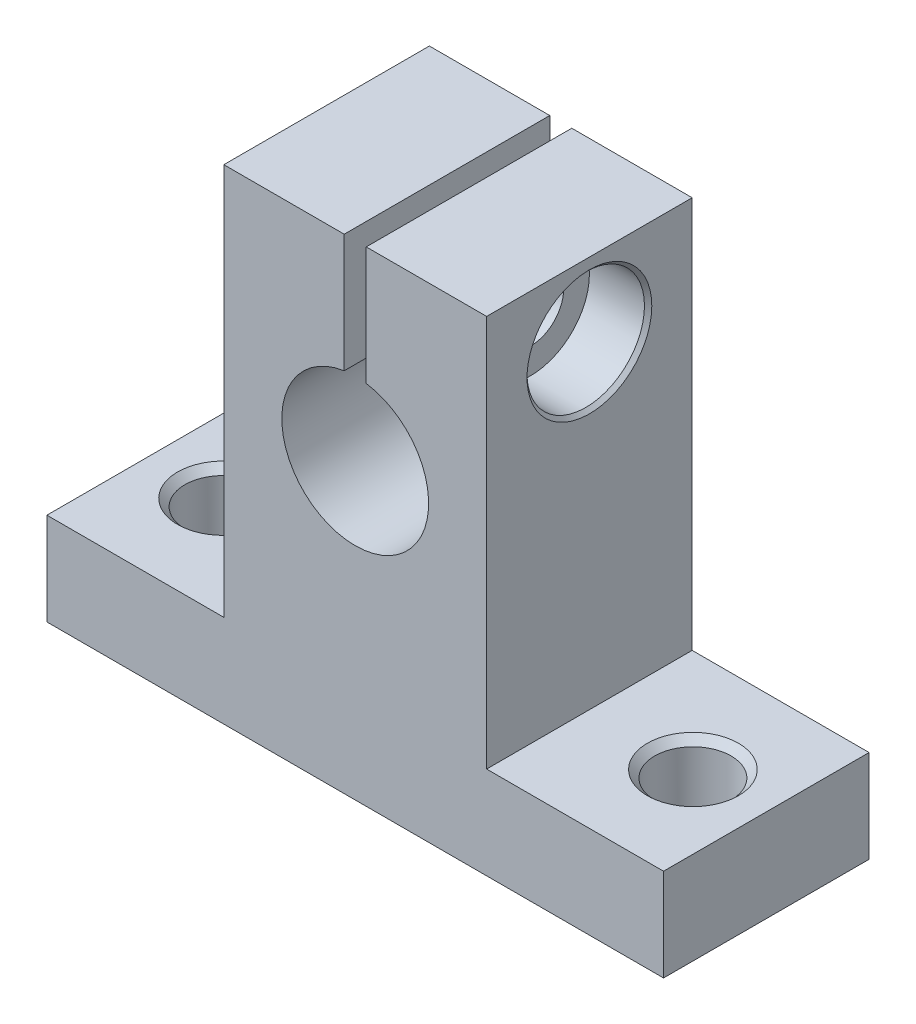
ISO-10303-21;
HEADER;
FILE_DESCRIPTION(('STEP AP214'),'2;1');
FILE_NAME('part.step','',(''),(''),'','','');
FILE_SCHEMA(('AUTOMOTIVE_DESIGN { 1 0 10303 214 1 1 1 1 }'));
ENDSEC;
DATA;
#1=APPLICATION_CONTEXT('core data for automotive mechanical design processes');
#2=APPLICATION_PROTOCOL_DEFINITION('international standard','automotive_design',2000,#1);
#3=PRODUCT_CONTEXT('',#1,'mechanical');
#4=PRODUCT('Part','Part','',(#3));
#5=PRODUCT_RELATED_PRODUCT_CATEGORY('part','',(#4));
#6=PRODUCT_DEFINITION_FORMATION('','',#4);
#7=PRODUCT_DEFINITION_CONTEXT('part definition',#1,'design');
#8=PRODUCT_DEFINITION('design','',#6,#7);
#9=PRODUCT_DEFINITION_SHAPE('','',#8);
#10=(LENGTH_UNIT() NAMED_UNIT(*) SI_UNIT(.MILLI.,.METRE.));
#11=(NAMED_UNIT(*) PLANE_ANGLE_UNIT() SI_UNIT($,.RADIAN.));
#12=(NAMED_UNIT(*) SI_UNIT($,.STERADIAN.) SOLID_ANGLE_UNIT());
#13=UNCERTAINTY_MEASURE_WITH_UNIT(LENGTH_MEASURE(1.E-05),#10,'distance_accuracy_value','');
#14=(GEOMETRIC_REPRESENTATION_CONTEXT(3) GLOBAL_UNCERTAINTY_ASSIGNED_CONTEXT((#13)) GLOBAL_UNIT_ASSIGNED_CONTEXT((#10,
#11,#12)) REPRESENTATION_CONTEXT('',''));
#15=CARTESIAN_POINT('',(0.,0.,0.));
#16=DIRECTION('',(0.,0.,1.));
#17=DIRECTION('',(1.,0.,0.));
#18=AXIS2_PLACEMENT_3D('',#15,#16,#17);
#19=CARTESIAN_POINT('',(-0.75,33.,7.));
#20=DIRECTION('',(-1.,0.,0.));
#21=DIRECTION('',(0.,-1.,0.));
#22=AXIS2_PLACEMENT_3D('',#19,#20,#21);
#23=PLANE('',#22);
#24=DIRECTION('',(0.,1.,0.));
#25=VECTOR('',#24,1.);
#26=CARTESIAN_POINT('',(-0.75,33.,-7.));
#27=LINE('',#26,#25);
#28=CARTESIAN_POINT('',(-0.750000000000001,24.9434299833213,-7.));
#29=VERTEX_POINT('',#28);
#30=CARTESIAN_POINT('',(-0.75,33.,-7.));
#31=VERTEX_POINT('',#30);
#32=EDGE_CURVE('E176',#29,#31,#27,.T.);
#33=ORIENTED_EDGE('',*,*,#32,.T.);
#34=DIRECTION('',(0.,0.,-1.));
#35=VECTOR('',#34,1.);
#36=CARTESIAN_POINT('',(-0.75,33.,7.));
#37=LINE('',#36,#35);
#38=CARTESIAN_POINT('',(-0.75,33.,7.));
#39=VERTEX_POINT('',#38);
#40=EDGE_CURVE('E149',#39,#31,#37,.T.);
#41=ORIENTED_EDGE('',*,*,#40,.F.);
#42=DIRECTION('',(0.,1.,0.));
#43=VECTOR('',#42,1.);
#44=CARTESIAN_POINT('',(-0.75,33.,7.));
#45=LINE('',#44,#43);
#46=CARTESIAN_POINT('',(-0.750000000000001,24.9434299833213,7.));
#47=VERTEX_POINT('',#46);
#48=EDGE_CURVE('E140',#47,#39,#45,.T.);
#49=ORIENTED_EDGE('',*,*,#48,.F.);
#50=DIRECTION('',(0.,0.,-1.));
#51=VECTOR('',#50,1.);
#52=CARTESIAN_POINT('',(-0.750000000000001,24.9434299833213,7.));
#53=LINE('',#52,#51);
#54=EDGE_CURVE('E185',#47,#29,#53,.T.);
#55=ORIENTED_EDGE('',*,*,#54,.T.);
#56=EDGE_LOOP('',(#33,#41,#49,#55));
#57=FACE_BOUND('',#56,.T.);
#58=CARTESIAN_POINT('',(-0.75,28.,0.));
#59=DIRECTION('',(1.,0.,0.));
#60=DIRECTION('',(0.,0.,-1.));
#61=AXIS2_PLACEMENT_3D('',#58,#59,#60);
#62=CIRCLE('',#61,1.65);
#63=CARTESIAN_POINT('',(-0.75,28.,-1.65));
#64=VERTEX_POINT('',#63);
#65=EDGE_CURVE('E357',#64,#64,#62,.T.);
#66=ORIENTED_EDGE('',*,*,#65,.F.);
#67=EDGE_LOOP('',(#66));
#68=FACE_BOUND('',#67,.T.);
#69=ADVANCED_FACE('F36',(#57,#68),#23,.F.);
#70=CARTESIAN_POINT('',(-21.,6.3,7.));
#71=DIRECTION('',(1.,0.,0.));
#72=DIRECTION('',(0.,0.,-1.));
#73=AXIS2_PLACEMENT_3D('',#70,#71,#72);
#74=PLANE('',#73);
#75=DIRECTION('',(0.,-1.,0.));
#76=VECTOR('',#75,1.);
#77=CARTESIAN_POINT('',(-21.,6.3,-7.));
#78=LINE('',#77,#76);
#79=CARTESIAN_POINT('',(-21.,6.3,-7.));
#80=VERTEX_POINT('',#79);
#81=CARTESIAN_POINT('',(-21.,0.,-7.));
#82=VERTEX_POINT('',#81);
#83=EDGE_CURVE('E158',#80,#82,#78,.T.);
#84=ORIENTED_EDGE('',*,*,#83,.T.);
#85=DIRECTION('',(0.,0.,-1.));
#86=VECTOR('',#85,1.);
#87=CARTESIAN_POINT('',(-21.,0.,7.));
#88=LINE('',#87,#86);
#89=CARTESIAN_POINT('',(-21.,0.,7.));
#90=VERTEX_POINT('',#89);
#91=EDGE_CURVE('E206',#90,#82,#88,.T.);
#92=ORIENTED_EDGE('',*,*,#91,.F.);
#93=DIRECTION('',(0.,-1.,0.));
#94=VECTOR('',#93,1.);
#95=CARTESIAN_POINT('',(-21.,6.3,7.));
#96=LINE('',#95,#94);
#97=CARTESIAN_POINT('',(-21.,6.3,7.));
#98=VERTEX_POINT('',#97);
#99=EDGE_CURVE('E181',#98,#90,#96,.T.);
#100=ORIENTED_EDGE('',*,*,#99,.F.);
#101=DIRECTION('',(0.,0.,-1.));
#102=VECTOR('',#101,1.);
#103=CARTESIAN_POINT('',(-21.,6.3,7.));
#104=LINE('',#103,#102);
#105=EDGE_CURVE('E154',#98,#80,#104,.T.);
#106=ORIENTED_EDGE('',*,*,#105,.T.);
#107=EDGE_LOOP('',(#84,#92,#100,#106));
#108=FACE_BOUND('',#107,.T.);
#109=ADVANCED_FACE('F233',(#108),#74,.F.);
#110=CARTESIAN_POINT('',(-21.,0.,7.));
#111=DIRECTION('',(0.,1.,0.));
#112=DIRECTION('',(0.,0.,1.));
#113=AXIS2_PLACEMENT_3D('',#110,#111,#112);
#114=PLANE('',#113);
#115=CARTESIAN_POINT('',(16.,0.,0.));
#116=DIRECTION('',(0.,1.,0.));
#117=DIRECTION('',(0.,0.,1.));
#118=AXIS2_PLACEMENT_3D('',#115,#116,#117);
#119=CIRCLE('',#118,2.6);
#120=CARTESIAN_POINT('',(16.,0.,2.6));
#121=VERTEX_POINT('',#120);
#122=EDGE_CURVE('E162',#121,#121,#119,.F.);
#123=ORIENTED_EDGE('',*,*,#122,.F.);
#124=EDGE_LOOP('',(#123));
#125=FACE_BOUND('',#124,.T.);
#126=CARTESIAN_POINT('',(-16.,0.,0.));
#127=DIRECTION('',(0.,1.,0.));
#128=DIRECTION('',(0.,0.,1.));
#129=AXIS2_PLACEMENT_3D('',#126,#127,#128);
#130=CIRCLE('',#129,2.6);
#131=CARTESIAN_POINT('',(-16.,0.,2.6));
#132=VERTEX_POINT('',#131);
#133=EDGE_CURVE('E279',#132,#132,#130,.F.);
#134=ORIENTED_EDGE('',*,*,#133,.F.);
#135=EDGE_LOOP('',(#134));
#136=FACE_BOUND('',#135,.T.);
#137=DIRECTION('',(1.,0.,0.));
#138=VECTOR('',#137,1.);
#139=CARTESIAN_POINT('',(-21.,0.,-7.));
#140=LINE('',#139,#138);
#141=CARTESIAN_POINT('',(21.,0.,-7.));
#142=VERTEX_POINT('',#141);
#143=EDGE_CURVE('E161',#82,#142,#140,.T.);
#144=ORIENTED_EDGE('',*,*,#143,.T.);
#145=DIRECTION('',(0.,0.,-1.));
#146=VECTOR('',#145,1.);
#147=CARTESIAN_POINT('',(21.,0.,7.));
#148=LINE('',#147,#146);
#149=CARTESIAN_POINT('',(21.,0.,7.));
#150=VERTEX_POINT('',#149);
#151=EDGE_CURVE('E203',#150,#142,#148,.T.);
#152=ORIENTED_EDGE('',*,*,#151,.F.);
#153=DIRECTION('',(1.,0.,0.));
#154=VECTOR('',#153,1.);
#155=CARTESIAN_POINT('',(-21.,0.,7.));
#156=LINE('',#155,#154);
#157=EDGE_CURVE('E109',#90,#150,#156,.T.);
#158=ORIENTED_EDGE('',*,*,#157,.F.);
#159=ORIENTED_EDGE('',*,*,#91,.T.);
#160=EDGE_LOOP('',(#144,#152,#158,#159));
#161=FACE_BOUND('',#160,.T.);
#162=ADVANCED_FACE('F239',(#125,#136,#161),#114,.F.);
#163=CARTESIAN_POINT('',(21.,6.3,7.));
#164=DIRECTION('',(-1.,0.,0.));
#165=DIRECTION('',(0.,0.,1.));
#166=AXIS2_PLACEMENT_3D('',#163,#164,#165);
#167=PLANE('',#166);
#168=DIRECTION('',(0.,1.,0.));
#169=VECTOR('',#168,1.);
#170=CARTESIAN_POINT('',(21.,6.3,-7.));
#171=LINE('',#170,#169);
#172=CARTESIAN_POINT('',(21.,6.3,-7.));
#173=VERTEX_POINT('',#172);
#174=EDGE_CURVE('E164',#142,#173,#171,.T.);
#175=ORIENTED_EDGE('',*,*,#174,.T.);
#176=DIRECTION('',(0.,0.,-1.));
#177=VECTOR('',#176,1.);
#178=CARTESIAN_POINT('',(21.,6.3,7.));
#179=LINE('',#178,#177);
#180=CARTESIAN_POINT('',(21.,6.3,7.));
#181=VERTEX_POINT('',#180);
#182=EDGE_CURVE('E200',#181,#173,#179,.T.);
#183=ORIENTED_EDGE('',*,*,#182,.F.);
#184=DIRECTION('',(0.,1.,0.));
#185=VECTOR('',#184,1.);
#186=CARTESIAN_POINT('',(21.,6.3,7.));
#187=LINE('',#186,#185);
#188=EDGE_CURVE('E286',#150,#181,#187,.T.);
#189=ORIENTED_EDGE('',*,*,#188,.F.);
#190=ORIENTED_EDGE('',*,*,#151,.T.);
#191=EDGE_LOOP('',(#175,#183,#189,#190));
#192=FACE_BOUND('',#191,.T.);
#193=ADVANCED_FACE('F265',(#192),#167,.F.);
#194=CARTESIAN_POINT('',(8.95,6.3,7.));
#195=DIRECTION('',(0.,-1.,0.));
#196=DIRECTION('',(0.,0.,-1.));
#197=AXIS2_PLACEMENT_3D('',#194,#195,#196);
#198=PLANE('',#197);
#199=CARTESIAN_POINT('',(16.,6.3,0.));
#200=DIRECTION('',(0.,-1.,0.));
#201=DIRECTION('',(0.,0.,-1.));
#202=AXIS2_PLACEMENT_3D('',#199,#200,#201);
#203=CIRCLE('',#202,3.09999999999999);
#204=CARTESIAN_POINT('',(16.,6.3,-3.09999999999999));
#205=VERTEX_POINT('',#204);
#206=EDGE_CURVE('E11',#205,#205,#203,.T.);
#207=ORIENTED_EDGE('',*,*,#206,.T.);
#208=EDGE_LOOP('',(#207));
#209=FACE_BOUND('',#208,.T.);
#210=DIRECTION('',(-1.,0.,0.));
#211=VECTOR('',#210,1.);
#212=CARTESIAN_POINT('',(8.95,6.3,-7.));
#213=LINE('',#212,#211);
#214=CARTESIAN_POINT('',(8.95,6.3,-7.));
#215=VERTEX_POINT('',#214);
#216=EDGE_CURVE('E166',#173,#215,#213,.T.);
#217=ORIENTED_EDGE('',*,*,#216,.T.);
#218=DIRECTION('',(0.,0.,-1.));
#219=VECTOR('',#218,1.);
#220=CARTESIAN_POINT('',(8.95,6.3,7.));
#221=LINE('',#220,#219);
#222=CARTESIAN_POINT('',(8.95,6.3,7.));
#223=VERTEX_POINT('',#222);
#224=EDGE_CURVE('E197',#223,#215,#221,.T.);
#225=ORIENTED_EDGE('',*,*,#224,.F.);
#226=DIRECTION('',(-1.,0.,0.));
#227=VECTOR('',#226,1.);
#228=CARTESIAN_POINT('',(8.95,6.3,7.));
#229=LINE('',#228,#227);
#230=EDGE_CURVE('E300',#181,#223,#229,.T.);
#231=ORIENTED_EDGE('',*,*,#230,.F.);
#232=ORIENTED_EDGE('',*,*,#182,.T.);
#233=EDGE_LOOP('',(#217,#225,#231,#232));
#234=FACE_BOUND('',#233,.T.);
#235=ADVANCED_FACE('F261',(#209,#234),#198,.F.);
#236=CARTESIAN_POINT('',(8.95,33.,7.));
#237=DIRECTION('',(-1.,0.,0.));
#238=DIRECTION('',(0.,-1.,0.));
#239=AXIS2_PLACEMENT_3D('',#236,#237,#238);
#240=PLANE('',#239);
#241=CARTESIAN_POINT('',(8.95,28.,0.));
#242=DIRECTION('',(1.,0.,0.));
#243=DIRECTION('',(0.,0.,-1.));
#244=AXIS2_PLACEMENT_3D('',#241,#242,#243);
#245=CIRCLE('',#244,4.25);
#246=CARTESIAN_POINT('',(8.95,28.,-4.25));
#247=VERTEX_POINT('',#246);
#248=EDGE_CURVE('E359',#247,#247,#245,.T.);
#249=ORIENTED_EDGE('',*,*,#248,.F.);
#250=EDGE_LOOP('',(#249));
#251=FACE_BOUND('',#250,.T.);
#252=DIRECTION('',(0.,1.,0.));
#253=VECTOR('',#252,1.);
#254=CARTESIAN_POINT('',(8.95,33.,-7.));
#255=LINE('',#254,#253);
#256=CARTESIAN_POINT('',(8.95,33.,-7.));
#257=VERTEX_POINT('',#256);
#258=EDGE_CURVE('E168',#215,#257,#255,.T.);
#259=ORIENTED_EDGE('',*,*,#258,.T.);
#260=DIRECTION('',(0.,0.,-1.));
#261=VECTOR('',#260,1.);
#262=CARTESIAN_POINT('',(8.95,33.,7.));
#263=LINE('',#262,#261);
#264=CARTESIAN_POINT('',(8.95,33.,7.));
#265=VERTEX_POINT('',#264);
#266=EDGE_CURVE('E194',#265,#257,#263,.T.);
#267=ORIENTED_EDGE('',*,*,#266,.F.);
#268=DIRECTION('',(0.,1.,0.));
#269=VECTOR('',#268,1.);
#270=CARTESIAN_POINT('',(8.95,33.,7.));
#271=LINE('',#270,#269);
#272=EDGE_CURVE('E297',#223,#265,#271,.T.);
#273=ORIENTED_EDGE('',*,*,#272,.F.);
#274=ORIENTED_EDGE('',*,*,#224,.T.);
#275=EDGE_LOOP('',(#259,#267,#273,#274));
#276=FACE_BOUND('',#275,.T.);
#277=ADVANCED_FACE('F257',(#251,#276),#240,.F.);
#278=CARTESIAN_POINT('',(0.75,33.,7.));
#279=DIRECTION('',(0.,-1.,0.));
#280=DIRECTION('',(0.,0.,-1.));
#281=AXIS2_PLACEMENT_3D('',#278,#279,#280);
#282=PLANE('',#281);
#283=DIRECTION('',(-1.,0.,0.));
#284=VECTOR('',#283,1.);
#285=CARTESIAN_POINT('',(0.75,33.,-7.));
#286=LINE('',#285,#284);
#287=CARTESIAN_POINT('',(0.75,33.,-7.));
#288=VERTEX_POINT('',#287);
#289=EDGE_CURVE('E170',#257,#288,#286,.T.);
#290=ORIENTED_EDGE('',*,*,#289,.T.);
#291=DIRECTION('',(0.,0.,-1.));
#292=VECTOR('',#291,1.);
#293=CARTESIAN_POINT('',(0.75,33.,7.));
#294=LINE('',#293,#292);
#295=CARTESIAN_POINT('',(0.75,33.,7.));
#296=VERTEX_POINT('',#295);
#297=EDGE_CURVE('E191',#296,#288,#294,.T.);
#298=ORIENTED_EDGE('',*,*,#297,.F.);
#299=DIRECTION('',(-1.,0.,0.));
#300=VECTOR('',#299,1.);
#301=CARTESIAN_POINT('',(0.75,33.,7.));
#302=LINE('',#301,#300);
#303=EDGE_CURVE('E299',#265,#296,#302,.T.);
#304=ORIENTED_EDGE('',*,*,#303,.F.);
#305=ORIENTED_EDGE('',*,*,#266,.T.);
#306=EDGE_LOOP('',(#290,#298,#304,#305));
#307=FACE_BOUND('',#306,.T.);
#308=ADVANCED_FACE('F253',(#307),#282,.F.);
#309=CARTESIAN_POINT('',(0.75,33.,7.));
#310=DIRECTION('',(1.,0.,0.));
#311=DIRECTION('',(0.,1.,0.));
#312=AXIS2_PLACEMENT_3D('',#309,#310,#311);
#313=PLANE('',#312);
#314=CARTESIAN_POINT('',(0.750000000000001,28.,0.));
#315=DIRECTION('',(1.,0.,0.));
#316=DIRECTION('',(0.,1.,0.));
#317=AXIS2_PLACEMENT_3D('',#314,#315,#316);
#318=CIRCLE('',#317,2.25);
#319=CARTESIAN_POINT('',(0.75,30.25,0.));
#320=VERTEX_POINT('',#319);
#321=EDGE_CURVE('E373',#320,#320,#318,.T.);
#322=ORIENTED_EDGE('',*,*,#321,.T.);
#323=EDGE_LOOP('',(#322));
#324=FACE_BOUND('',#323,.T.);
#325=DIRECTION('',(0.,-1.,0.));
#326=VECTOR('',#325,1.);
#327=CARTESIAN_POINT('',(0.75,33.,-7.));
#328=LINE('',#327,#326);
#329=CARTESIAN_POINT('',(0.750000000000002,24.9434299833213,-7.));
#330=VERTEX_POINT('',#329);
#331=EDGE_CURVE('E172',#288,#330,#328,.T.);
#332=ORIENTED_EDGE('',*,*,#331,.T.);
#333=DIRECTION('',(0.,0.,-1.));
#334=VECTOR('',#333,1.);
#335=CARTESIAN_POINT('',(0.750000000000002,24.9434299833213,7.));
#336=LINE('',#335,#334);
#337=CARTESIAN_POINT('',(0.750000000000002,24.9434299833213,7.));
#338=VERTEX_POINT('',#337);
#339=EDGE_CURVE('E188',#338,#330,#336,.T.);
#340=ORIENTED_EDGE('',*,*,#339,.F.);
#341=DIRECTION('',(0.,-1.,0.));
#342=VECTOR('',#341,1.);
#343=CARTESIAN_POINT('',(0.75,33.,7.));
#344=LINE('',#343,#342);
#345=EDGE_CURVE('E302',#296,#338,#344,.T.);
#346=ORIENTED_EDGE('',*,*,#345,.F.);
#347=ORIENTED_EDGE('',*,*,#297,.T.);
#348=EDGE_LOOP('',(#332,#340,#346,#347));
#349=FACE_BOUND('',#348,.T.);
#350=ADVANCED_FACE('F249',(#324,#349),#313,.F.);
#351=CARTESIAN_POINT('',(0.,20.,7.));
#352=DIRECTION('',(0.,0.,-1.));
#353=DIRECTION('',(-1.,0.,0.));
#354=AXIS2_PLACEMENT_3D('',#351,#352,#353);
#355=CYLINDRICAL_SURFACE('',#354,5.);
#356=CARTESIAN_POINT('',(0.,20.,-7.));
#357=DIRECTION('',(0.,0.,-1.));
#358=DIRECTION('',(1.,0.,0.));
#359=AXIS2_PLACEMENT_3D('',#356,#357,#358);
#360=CIRCLE('',#359,5.);
#361=EDGE_CURVE('E174',#330,#29,#360,.T.);
#362=ORIENTED_EDGE('',*,*,#361,.T.);
#363=ORIENTED_EDGE('',*,*,#54,.F.);
#364=CARTESIAN_POINT('',(0.,20.,7.));
#365=DIRECTION('',(0.,0.,-1.));
#366=DIRECTION('',(1.,0.,0.));
#367=AXIS2_PLACEMENT_3D('',#364,#365,#366);
#368=CIRCLE('',#367,5.);
#369=EDGE_CURVE('E308',#338,#47,#368,.T.);
#370=ORIENTED_EDGE('',*,*,#369,.F.);
#371=ORIENTED_EDGE('',*,*,#339,.T.);
#372=EDGE_LOOP('',(#362,#363,#370,#371));
#373=FACE_BOUND('',#372,.T.);
#374=ADVANCED_FACE('F246',(#373),#355,.F.);
#375=CARTESIAN_POINT('',(-8.95,33.,7.));
#376=DIRECTION('',(0.,-1.,0.));
#377=DIRECTION('',(0.,0.,-1.));
#378=AXIS2_PLACEMENT_3D('',#375,#376,#377);
#379=PLANE('',#378);
#380=DIRECTION('',(-1.,0.,0.));
#381=VECTOR('',#380,1.);
#382=CARTESIAN_POINT('',(-8.95,33.,-7.));
#383=LINE('',#382,#381);
#384=CARTESIAN_POINT('',(-8.95,33.,-7.));
#385=VERTEX_POINT('',#384);
#386=EDGE_CURVE('E148',#31,#385,#383,.T.);
#387=ORIENTED_EDGE('',*,*,#386,.T.);
#388=DIRECTION('',(0.,0.,-1.));
#389=VECTOR('',#388,1.);
#390=CARTESIAN_POINT('',(-8.95,33.,7.));
#391=LINE('',#390,#389);
#392=CARTESIAN_POINT('',(-8.95,33.,7.));
#393=VERTEX_POINT('',#392);
#394=EDGE_CURVE('E145',#393,#385,#391,.T.);
#395=ORIENTED_EDGE('',*,*,#394,.F.);
#396=DIRECTION('',(-1.,0.,0.));
#397=VECTOR('',#396,1.);
#398=CARTESIAN_POINT('',(-8.95,33.,7.));
#399=LINE('',#398,#397);
#400=EDGE_CURVE('E134',#39,#393,#399,.T.);
#401=ORIENTED_EDGE('',*,*,#400,.F.);
#402=ORIENTED_EDGE('',*,*,#40,.T.);
#403=EDGE_LOOP('',(#387,#395,#401,#402));
#404=FACE_BOUND('',#403,.T.);
#405=ADVANCED_FACE('F146',(#404),#379,.F.);
#406=CARTESIAN_POINT('',(-8.95,33.,7.));
#407=DIRECTION('',(1.,0.,0.));
#408=DIRECTION('',(0.,1.,0.));
#409=AXIS2_PLACEMENT_3D('',#406,#407,#408);
#410=PLANE('',#409);
#411=CARTESIAN_POINT('',(-8.95,28.,0.));
#412=DIRECTION('',(1.,0.,0.));
#413=DIRECTION('',(0.,1.,0.));
#414=AXIS2_PLACEMENT_3D('',#411,#412,#413);
#415=CIRCLE('',#414,1.65);
#416=CARTESIAN_POINT('',(-8.95,29.65,0.));
#417=VERTEX_POINT('',#416);
#418=EDGE_CURVE('E354',#417,#417,#415,.T.);
#419=ORIENTED_EDGE('',*,*,#418,.T.);
#420=EDGE_LOOP('',(#419));
#421=FACE_BOUND('',#420,.T.);
#422=DIRECTION('',(0.,-1.,0.));
#423=VECTOR('',#422,1.);
#424=CARTESIAN_POINT('',(-8.95,33.,-7.));
#425=LINE('',#424,#423);
#426=CARTESIAN_POINT('',(-8.95,6.3,-7.));
#427=VERTEX_POINT('',#426);
#428=EDGE_CURVE('E94',#385,#427,#425,.T.);
#429=ORIENTED_EDGE('',*,*,#428,.T.);
#430=DIRECTION('',(0.,0.,-1.));
#431=VECTOR('',#430,1.);
#432=CARTESIAN_POINT('',(-8.95,6.3,7.));
#433=LINE('',#432,#431);
#434=CARTESIAN_POINT('',(-8.95,6.3,7.));
#435=VERTEX_POINT('',#434);
#436=EDGE_CURVE('E150',#435,#427,#433,.T.);
#437=ORIENTED_EDGE('',*,*,#436,.F.);
#438=DIRECTION('',(0.,-1.,0.));
#439=VECTOR('',#438,1.);
#440=CARTESIAN_POINT('',(-8.95,33.,7.));
#441=LINE('',#440,#439);
#442=EDGE_CURVE('E138',#393,#435,#441,.T.);
#443=ORIENTED_EDGE('',*,*,#442,.F.);
#444=ORIENTED_EDGE('',*,*,#394,.T.);
#445=EDGE_LOOP('',(#429,#437,#443,#444));
#446=FACE_BOUND('',#445,.T.);
#447=ADVANCED_FACE('F152',(#421,#446),#410,.F.);
#448=CARTESIAN_POINT('',(-21.,6.3,7.));
#449=DIRECTION('',(0.,-1.,0.));
#450=DIRECTION('',(0.,0.,-1.));
#451=AXIS2_PLACEMENT_3D('',#448,#449,#450);
#452=PLANE('',#451);
#453=CARTESIAN_POINT('',(-16.,6.3,0.));
#454=DIRECTION('',(0.,-1.,0.));
#455=DIRECTION('',(0.,0.,-1.));
#456=AXIS2_PLACEMENT_3D('',#453,#454,#455);
#457=CIRCLE('',#456,3.09999999999999);
#458=CARTESIAN_POINT('',(-16.,6.3,-3.09999999999999));
#459=VERTEX_POINT('',#458);
#460=EDGE_CURVE('E211',#459,#459,#457,.T.);
#461=ORIENTED_EDGE('',*,*,#460,.T.);
#462=EDGE_LOOP('',(#461));
#463=FACE_BOUND('',#462,.T.);
#464=DIRECTION('',(-1.,0.,0.));
#465=VECTOR('',#464,1.);
#466=CARTESIAN_POINT('',(-21.,6.3,-7.));
#467=LINE('',#466,#465);
#468=EDGE_CURVE('E100',#427,#80,#467,.T.);
#469=ORIENTED_EDGE('',*,*,#468,.T.);
#470=ORIENTED_EDGE('',*,*,#105,.F.);
#471=DIRECTION('',(-1.,0.,0.));
#472=VECTOR('',#471,1.);
#473=CARTESIAN_POINT('',(-21.,6.3,7.));
#474=LINE('',#473,#472);
#475=EDGE_CURVE('E53',#435,#98,#474,.T.);
#476=ORIENTED_EDGE('',*,*,#475,.F.);
#477=ORIENTED_EDGE('',*,*,#436,.T.);
#478=EDGE_LOOP('',(#469,#470,#476,#477));
#479=FACE_BOUND('',#478,.T.);
#480=ADVANCED_FACE('F316',(#463,#479),#452,.F.);
#481=CARTESIAN_POINT('',(0.,20.,7.));
#482=DIRECTION('',(0.,0.,1.));
#483=DIRECTION('',(1.,0.,0.));
#484=AXIS2_PLACEMENT_3D('',#481,#482,#483);
#485=PLANE('',#484);
#486=ORIENTED_EDGE('',*,*,#99,.T.);
#487=ORIENTED_EDGE('',*,*,#157,.T.);
#488=ORIENTED_EDGE('',*,*,#188,.T.);
#489=ORIENTED_EDGE('',*,*,#230,.T.);
#490=ORIENTED_EDGE('',*,*,#272,.T.);
#491=ORIENTED_EDGE('',*,*,#303,.T.);
#492=ORIENTED_EDGE('',*,*,#345,.T.);
#493=ORIENTED_EDGE('',*,*,#369,.T.);
#494=ORIENTED_EDGE('',*,*,#48,.T.);
#495=ORIENTED_EDGE('',*,*,#400,.T.);
#496=ORIENTED_EDGE('',*,*,#442,.T.);
#497=ORIENTED_EDGE('',*,*,#475,.T.);
#498=EDGE_LOOP('',(#486,#487,#488,#489,#490,#491,#492,#493,#494,#495,#496,#497));
#499=FACE_BOUND('',#498,.T.);
#500=ADVANCED_FACE('F136',(#499),#485,.T.);
#501=CARTESIAN_POINT('',(0.,20.,-7.));
#502=DIRECTION('',(0.,0.,1.));
#503=DIRECTION('',(1.,0.,0.));
#504=AXIS2_PLACEMENT_3D('',#501,#502,#503);
#505=PLANE('',#504);
#506=ORIENTED_EDGE('',*,*,#83,.F.);
#507=ORIENTED_EDGE('',*,*,#468,.F.);
#508=ORIENTED_EDGE('',*,*,#428,.F.);
#509=ORIENTED_EDGE('',*,*,#386,.F.);
#510=ORIENTED_EDGE('',*,*,#32,.F.);
#511=ORIENTED_EDGE('',*,*,#361,.F.);
#512=ORIENTED_EDGE('',*,*,#331,.F.);
#513=ORIENTED_EDGE('',*,*,#289,.F.);
#514=ORIENTED_EDGE('',*,*,#258,.F.);
#515=ORIENTED_EDGE('',*,*,#216,.F.);
#516=ORIENTED_EDGE('',*,*,#174,.F.);
#517=ORIENTED_EDGE('',*,*,#143,.F.);
#518=EDGE_LOOP('',(#506,#507,#508,#509,#510,#511,#512,#513,#514,#515,#516,#517));
#519=FACE_BOUND('',#518,.T.);
#520=ADVANCED_FACE('F288',(#519),#505,.F.);
#521=CARTESIAN_POINT('',(-16.,-0.00100000000000013,0.));
#522=DIRECTION('',(0.,1.,0.));
#523=DIRECTION('',(0.,0.,1.));
#524=AXIS2_PLACEMENT_3D('',#521,#522,#523);
#525=CYLINDRICAL_SURFACE('',#524,2.6);
#526=CARTESIAN_POINT('',(-16.,5.80000000000001,0.));
#527=DIRECTION('',(0.,-1.,0.));
#528=DIRECTION('',(0.,0.,-1.));
#529=AXIS2_PLACEMENT_3D('',#526,#527,#528);
#530=CIRCLE('',#529,2.6);
#531=CARTESIAN_POINT('',(-16.,5.80000000000001,-2.6));
#532=VERTEX_POINT('',#531);
#533=EDGE_CURVE('E208',#532,#532,#530,.F.);
#534=ORIENTED_EDGE('',*,*,#533,.T.);
#535=EDGE_LOOP('',(#534));
#536=FACE_BOUND('',#535,.T.);
#537=ORIENTED_EDGE('',*,*,#133,.T.);
#538=EDGE_LOOP('',(#537));
#539=FACE_BOUND('',#538,.T.);
#540=ADVANCED_FACE('F328',(#536,#539),#525,.F.);
#541=CARTESIAN_POINT('',(16.,-0.00100000000000013,0.));
#542=DIRECTION('',(0.,1.,0.));
#543=DIRECTION('',(0.,0.,1.));
#544=AXIS2_PLACEMENT_3D('',#541,#542,#543);
#545=CYLINDRICAL_SURFACE('',#544,2.6);
#546=CARTESIAN_POINT('',(16.,5.80000000000001,0.));
#547=DIRECTION('',(0.,-1.,0.));
#548=DIRECTION('',(0.,0.,-1.));
#549=AXIS2_PLACEMENT_3D('',#546,#547,#548);
#550=CIRCLE('',#549,2.6);
#551=CARTESIAN_POINT('',(16.,5.80000000000001,-2.6));
#552=VERTEX_POINT('',#551);
#553=EDGE_CURVE('E45',#552,#552,#550,.F.);
#554=ORIENTED_EDGE('',*,*,#553,.T.);
#555=EDGE_LOOP('',(#554));
#556=FACE_BOUND('',#555,.T.);
#557=ORIENTED_EDGE('',*,*,#122,.T.);
#558=EDGE_LOOP('',(#557));
#559=FACE_BOUND('',#558,.T.);
#560=ADVANCED_FACE('F216',(#556,#559),#545,.F.);
#561=CARTESIAN_POINT('',(-16.,5.80000000000001,0.));
#562=DIRECTION('',(0.,1.,0.));
#563=DIRECTION('',(0.,0.,1.));
#564=AXIS2_PLACEMENT_3D('',#561,#562,#563);
#565=CONICAL_SURFACE('',#564,2.6,0.785398163397447);
#566=ORIENTED_EDGE('',*,*,#460,.F.);
#567=EDGE_LOOP('',(#566));
#568=FACE_BOUND('',#567,.T.);
#569=ORIENTED_EDGE('',*,*,#533,.F.);
#570=EDGE_LOOP('',(#569));
#571=FACE_BOUND('',#570,.T.);
#572=ADVANCED_FACE('F221',(#568,#571),#565,.F.);
#573=CARTESIAN_POINT('',(16.,5.80000000000001,0.));
#574=DIRECTION('',(0.,1.,0.));
#575=DIRECTION('',(0.,0.,1.));
#576=AXIS2_PLACEMENT_3D('',#573,#574,#575);
#577=CONICAL_SURFACE('',#576,2.6,0.785398163397446);
#578=ORIENTED_EDGE('',*,*,#206,.F.);
#579=EDGE_LOOP('',(#578));
#580=FACE_BOUND('',#579,.T.);
#581=ORIENTED_EDGE('',*,*,#553,.F.);
#582=EDGE_LOOP('',(#581));
#583=FACE_BOUND('',#582,.T.);
#584=ADVANCED_FACE('F38',(#580,#583),#577,.F.);
#585=CARTESIAN_POINT('',(8.95,28.,0.));
#586=DIRECTION('',(1.,0.,0.));
#587=DIRECTION('',(0.,0.,-1.));
#588=AXIS2_PLACEMENT_3D('',#585,#586,#587);
#589=CYLINDRICAL_SURFACE('',#588,2.25);
#590=ORIENTED_EDGE('',*,*,#321,.F.);
#591=EDGE_LOOP('',(#590));
#592=FACE_BOUND('',#591,.T.);
#593=CARTESIAN_POINT('',(4.95,28.,0.));
#594=DIRECTION('',(1.,0.,0.));
#595=DIRECTION('',(0.,0.,-1.));
#596=AXIS2_PLACEMENT_3D('',#593,#594,#595);
#597=CIRCLE('',#596,2.25);
#598=CARTESIAN_POINT('',(4.95,28.,-2.25));
#599=VERTEX_POINT('',#598);
#600=EDGE_CURVE('E370',#599,#599,#597,.T.);
#601=ORIENTED_EDGE('',*,*,#600,.T.);
#602=EDGE_LOOP('',(#601));
#603=FACE_BOUND('',#602,.T.);
#604=ADVANCED_FACE('F220',(#592,#603),#589,.F.);
#605=CARTESIAN_POINT('',(4.95,32.,0.));
#606=DIRECTION('',(-1.,0.,0.));
#607=DIRECTION('',(0.,0.,1.));
#608=AXIS2_PLACEMENT_3D('',#605,#606,#607);
#609=PLANE('',#608);
#610=ORIENTED_EDGE('',*,*,#600,.F.);
#611=EDGE_LOOP('',(#610));
#612=FACE_BOUND('',#611,.T.);
#613=CARTESIAN_POINT('',(4.95,28.,0.));
#614=DIRECTION('',(1.,0.,0.));
#615=DIRECTION('',(0.,0.,-1.));
#616=AXIS2_PLACEMENT_3D('',#613,#614,#615);
#617=CIRCLE('',#616,4.);
#618=CARTESIAN_POINT('',(4.95,28.,-4.));
#619=VERTEX_POINT('',#618);
#620=EDGE_CURVE('E367',#619,#619,#617,.T.);
#621=ORIENTED_EDGE('',*,*,#620,.T.);
#622=EDGE_LOOP('',(#621));
#623=FACE_BOUND('',#622,.T.);
#624=ADVANCED_FACE('F227',(#612,#623),#609,.F.);
#625=CARTESIAN_POINT('',(8.95,28.,0.));
#626=DIRECTION('',(1.,0.,0.));
#627=DIRECTION('',(0.,0.,-1.));
#628=AXIS2_PLACEMENT_3D('',#625,#626,#627);
#629=CYLINDRICAL_SURFACE('',#628,4.);
#630=ORIENTED_EDGE('',*,*,#620,.F.);
#631=EDGE_LOOP('',(#630));
#632=FACE_BOUND('',#631,.T.);
#633=CARTESIAN_POINT('',(8.7,28.,0.));
#634=DIRECTION('',(1.,0.,0.));
#635=DIRECTION('',(0.,0.,-1.));
#636=AXIS2_PLACEMENT_3D('',#633,#634,#635);
#637=CIRCLE('',#636,4.);
#638=CARTESIAN_POINT('',(8.7,28.,-4.));
#639=VERTEX_POINT('',#638);
#640=EDGE_CURVE('E364',#639,#639,#637,.T.);
#641=ORIENTED_EDGE('',*,*,#640,.T.);
#642=EDGE_LOOP('',(#641));
#643=FACE_BOUND('',#642,.T.);
#644=ADVANCED_FACE('F337',(#632,#643),#629,.F.);
#645=CARTESIAN_POINT('',(8.95,28.,0.));
#646=DIRECTION('',(1.,0.,0.));
#647=DIRECTION('',(0.,0.,-1.));
#648=AXIS2_PLACEMENT_3D('',#645,#646,#647);
#649=CONICAL_SURFACE('',#648,4.25,0.785398163397442);
#650=ORIENTED_EDGE('',*,*,#640,.F.);
#651=EDGE_LOOP('',(#650));
#652=FACE_BOUND('',#651,.T.);
#653=ORIENTED_EDGE('',*,*,#248,.T.);
#654=EDGE_LOOP('',(#653));
#655=FACE_BOUND('',#654,.T.);
#656=ADVANCED_FACE('F341',(#652,#655),#649,.F.);
#657=CARTESIAN_POINT('',(-0.75,28.,0.));
#658=DIRECTION('',(1.,0.,0.));
#659=DIRECTION('',(0.,0.,-1.));
#660=AXIS2_PLACEMENT_3D('',#657,#658,#659);
#661=CYLINDRICAL_SURFACE('',#660,1.65);
#662=ORIENTED_EDGE('',*,*,#418,.F.);
#663=EDGE_LOOP('',(#662));
#664=FACE_BOUND('',#663,.T.);
#665=ORIENTED_EDGE('',*,*,#65,.T.);
#666=EDGE_LOOP('',(#665));
#667=FACE_BOUND('',#666,.T.);
#668=ADVANCED_FACE('F345',(#664,#667),#661,.F.);
#669=CLOSED_SHELL('',(#69,#109,#162,#193,#235,#277,#308,#350,#374,#405,#447,#480,#500,#520,#540,
#560,#572,#584,#604,#624,#644,#656,#668));
#670=MANIFOLD_SOLID_BREP('B2',#669);
#671=ADVANCED_BREP_SHAPE_REPRESENTATION('',(#18,#670),#14);
#672=SHAPE_DEFINITION_REPRESENTATION(#9,#671);
ENDSEC;
END-ISO-10303-21;
